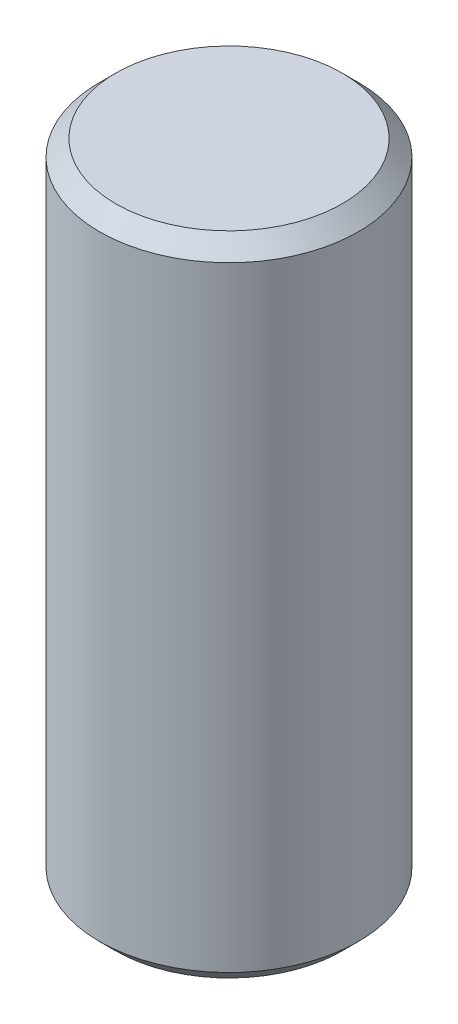
ISO-10303-21;
HEADER;
FILE_DESCRIPTION(('STEP AP214'),'2;1');
FILE_NAME('part.step','',(''),(''),'','','');
FILE_SCHEMA(('AUTOMOTIVE_DESIGN { 1 0 10303 214 1 1 1 1 }'));
ENDSEC;
DATA;
#1=APPLICATION_CONTEXT('core data for automotive mechanical design processes');
#2=APPLICATION_PROTOCOL_DEFINITION('international standard','automotive_design',2000,#1);
#3=PRODUCT_CONTEXT('',#1,'mechanical');
#4=PRODUCT('Part','Part','',(#3));
#5=PRODUCT_RELATED_PRODUCT_CATEGORY('part','',(#4));
#6=PRODUCT_DEFINITION_FORMATION('','',#4);
#7=PRODUCT_DEFINITION_CONTEXT('part definition',#1,'design');
#8=PRODUCT_DEFINITION('design','',#6,#7);
#9=PRODUCT_DEFINITION_SHAPE('','',#8);
#10=(LENGTH_UNIT() NAMED_UNIT(*) SI_UNIT(.MILLI.,.METRE.));
#11=(NAMED_UNIT(*) PLANE_ANGLE_UNIT() SI_UNIT($,.RADIAN.));
#12=(NAMED_UNIT(*) SI_UNIT($,.STERADIAN.) SOLID_ANGLE_UNIT());
#13=UNCERTAINTY_MEASURE_WITH_UNIT(LENGTH_MEASURE(1.E-05),#10,'distance_accuracy_value','');
#14=(GEOMETRIC_REPRESENTATION_CONTEXT(3) GLOBAL_UNCERTAINTY_ASSIGNED_CONTEXT((#13)) GLOBAL_UNIT_ASSIGNED_CONTEXT((#10,
#11,#12)) REPRESENTATION_CONTEXT('',''));
#15=CARTESIAN_POINT('',(0.,0.,0.));
#16=DIRECTION('',(0.,0.,1.));
#17=DIRECTION('',(1.,0.,0.));
#18=AXIS2_PLACEMENT_3D('',#15,#16,#17);
#19=CARTESIAN_POINT('',(0.,40.,0.));
#20=DIRECTION('',(0.,-1.,0.));
#21=DIRECTION('',(0.,0.,-1.));
#22=AXIS2_PLACEMENT_3D('',#19,#20,#21);
#23=CYLINDRICAL_SURFACE('',#22,8.);
#24=CARTESIAN_POINT('',(0.,1.00000000000002,0.));
#25=DIRECTION('',(0.,1.,0.));
#26=DIRECTION('',(0.,0.,1.));
#27=AXIS2_PLACEMENT_3D('',#24,#25,#26);
#28=CIRCLE('',#27,8.);
#29=CARTESIAN_POINT('',(0.,1.00000000000002,8.));
#30=VERTEX_POINT('',#29);
#31=EDGE_CURVE('E59',#30,#30,#28,.T.);
#32=ORIENTED_EDGE('',*,*,#31,.T.);
#33=EDGE_LOOP('',(#32));
#34=FACE_BOUND('',#33,.T.);
#35=CARTESIAN_POINT('',(0.,39.,0.));
#36=DIRECTION('',(0.,1.,0.));
#37=DIRECTION('',(0.,0.,1.));
#38=AXIS2_PLACEMENT_3D('',#35,#36,#37);
#39=CIRCLE('',#38,8.);
#40=CARTESIAN_POINT('',(0.,39.,8.));
#41=VERTEX_POINT('',#40);
#42=EDGE_CURVE('E65',#41,#41,#39,.F.);
#43=ORIENTED_EDGE('',*,*,#42,.T.);
#44=EDGE_LOOP('',(#43));
#45=FACE_BOUND('',#44,.T.);
#46=ADVANCED_FACE('F44',(#34,#45),#23,.T.);
#47=CARTESIAN_POINT('',(0.,40.,0.));
#48=DIRECTION('',(0.,1.,0.));
#49=DIRECTION('',(0.,0.,1.));
#50=AXIS2_PLACEMENT_3D('',#47,#48,#49);
#51=PLANE('',#50);
#52=CARTESIAN_POINT('',(0.,40.,0.));
#53=DIRECTION('',(0.,1.,0.));
#54=DIRECTION('',(0.,0.,1.));
#55=AXIS2_PLACEMENT_3D('',#52,#53,#54);
#56=CIRCLE('',#55,6.99999999999999);
#57=CARTESIAN_POINT('',(0.,40.,6.99999999999999));
#58=VERTEX_POINT('',#57);
#59=EDGE_CURVE('E10',#58,#58,#56,.T.);
#60=ORIENTED_EDGE('',*,*,#59,.T.);
#61=EDGE_LOOP('',(#60));
#62=FACE_BOUND('',#61,.T.);
#63=ADVANCED_FACE('F83',(#62),#51,.T.);
#64=CARTESIAN_POINT('',(0.,0.,0.));
#65=DIRECTION('',(0.,1.,0.));
#66=DIRECTION('',(0.,0.,1.));
#67=AXIS2_PLACEMENT_3D('',#64,#65,#66);
#68=PLANE('',#67);
#69=CARTESIAN_POINT('',(0.,0.,0.));
#70=DIRECTION('',(0.,1.,0.));
#71=DIRECTION('',(0.,0.,1.));
#72=AXIS2_PLACEMENT_3D('',#69,#70,#71);
#73=CIRCLE('',#72,6.99999999999997);
#74=CARTESIAN_POINT('',(0.,0.,6.99999999999997));
#75=VERTEX_POINT('',#74);
#76=EDGE_CURVE('E53',#75,#75,#73,.F.);
#77=ORIENTED_EDGE('',*,*,#76,.T.);
#78=EDGE_LOOP('',(#77));
#79=FACE_BOUND('',#78,.T.);
#80=ADVANCED_FACE('F80',(#79),#68,.F.);
#81=CARTESIAN_POINT('',(0.,1.00000000000002,0.));
#82=DIRECTION('',(0.,1.,0.));
#83=DIRECTION('',(0.,0.,1.));
#84=AXIS2_PLACEMENT_3D('',#81,#82,#83);
#85=CONICAL_SURFACE('',#84,8.,0.785398163397452);
#86=ORIENTED_EDGE('',*,*,#76,.F.);
#87=EDGE_LOOP('',(#86));
#88=FACE_BOUND('',#87,.T.);
#89=ORIENTED_EDGE('',*,*,#31,.F.);
#90=EDGE_LOOP('',(#89));
#91=FACE_BOUND('',#90,.T.);
#92=ADVANCED_FACE('F76',(#88,#91),#85,.T.);
#93=CARTESIAN_POINT('',(0.,40.,0.));
#94=DIRECTION('',(0.,-1.,0.));
#95=DIRECTION('',(0.,0.,-1.));
#96=AXIS2_PLACEMENT_3D('',#93,#94,#95);
#97=CONICAL_SURFACE('',#96,6.99999999999999,0.785398163397445);
#98=ORIENTED_EDGE('',*,*,#42,.F.);
#99=EDGE_LOOP('',(#98));
#100=FACE_BOUND('',#99,.T.);
#101=ORIENTED_EDGE('',*,*,#59,.F.);
#102=EDGE_LOOP('',(#101));
#103=FACE_BOUND('',#102,.T.);
#104=ADVANCED_FACE('F47',(#100,#103),#97,.T.);
#105=CLOSED_SHELL('',(#46,#63,#80,#92,#104));
#106=MANIFOLD_SOLID_BREP('B2',#105);
#107=ADVANCED_BREP_SHAPE_REPRESENTATION('',(#18,#106),#14);
#108=SHAPE_DEFINITION_REPRESENTATION(#9,#107);
ENDSEC;
END-ISO-10303-21;
